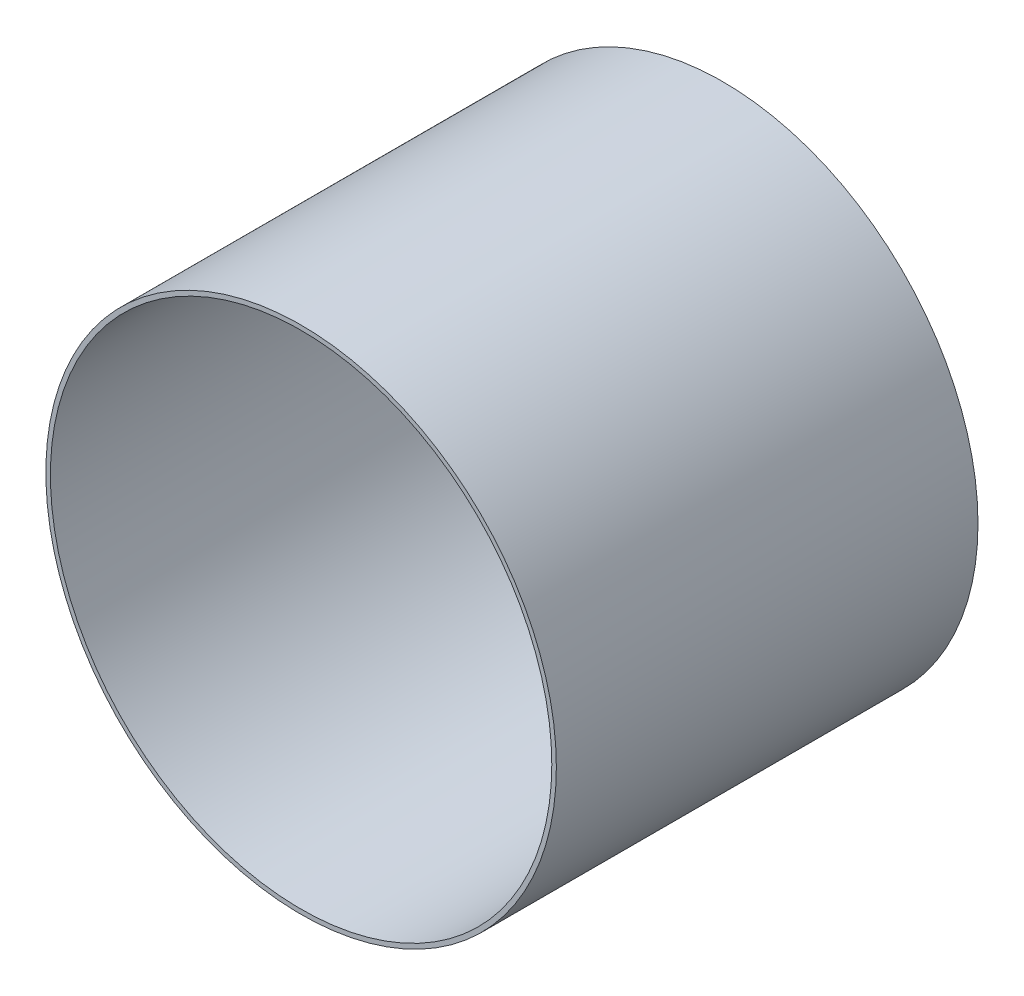
ISO-10303-21;
HEADER;
FILE_DESCRIPTION(('STEP AP214'),'2;1');
FILE_NAME('part.step','',(''),(''),'','','');
FILE_SCHEMA(('AUTOMOTIVE_DESIGN { 1 0 10303 214 1 1 1 1 }'));
ENDSEC;
DATA;
#1=APPLICATION_CONTEXT('core data for automotive mechanical design processes');
#2=APPLICATION_PROTOCOL_DEFINITION('international standard','automotive_design',2000,#1);
#3=PRODUCT_CONTEXT('',#1,'mechanical');
#4=PRODUCT('Part','Part','',(#3));
#5=PRODUCT_RELATED_PRODUCT_CATEGORY('part','',(#4));
#6=PRODUCT_DEFINITION_FORMATION('','',#4);
#7=PRODUCT_DEFINITION_CONTEXT('part definition',#1,'design');
#8=PRODUCT_DEFINITION('design','',#6,#7);
#9=PRODUCT_DEFINITION_SHAPE('','',#8);
#10=(LENGTH_UNIT() NAMED_UNIT(*) SI_UNIT(.MILLI.,.METRE.));
#11=(NAMED_UNIT(*) PLANE_ANGLE_UNIT() SI_UNIT($,.RADIAN.));
#12=(NAMED_UNIT(*) SI_UNIT($,.STERADIAN.) SOLID_ANGLE_UNIT());
#13=UNCERTAINTY_MEASURE_WITH_UNIT(LENGTH_MEASURE(1.E-05),#10,'distance_accuracy_value','');
#14=(GEOMETRIC_REPRESENTATION_CONTEXT(3) GLOBAL_UNCERTAINTY_ASSIGNED_CONTEXT((#13)) GLOBAL_UNIT_ASSIGNED_CONTEXT((#10,
#11,#12)) REPRESENTATION_CONTEXT('',''));
#15=CARTESIAN_POINT('',(0.,0.,0.));
#16=DIRECTION('',(0.,0.,1.));
#17=DIRECTION('',(1.,0.,0.));
#18=AXIS2_PLACEMENT_3D('',#15,#16,#17);
#19=CARTESIAN_POINT('',(0.,0.,117.475));
#20=DIRECTION('',(0.,0.,1.));
#21=DIRECTION('',(1.,0.,0.));
#22=AXIS2_PLACEMENT_3D('',#19,#20,#21);
#23=PLANE('',#22);
#24=CARTESIAN_POINT('',(0.,0.,117.475));
#25=DIRECTION('',(0.,0.,1.));
#26=DIRECTION('',(1.,0.,0.));
#27=AXIS2_PLACEMENT_3D('',#24,#25,#26);
#28=CIRCLE('',#27,71.12);
#29=CARTESIAN_POINT('',(71.12,0.,117.475));
#30=VERTEX_POINT('',#29);
#31=EDGE_CURVE('E10',#30,#30,#28,.T.);
#32=ORIENTED_EDGE('',*,*,#31,.T.);
#33=EDGE_LOOP('',(#32));
#34=FACE_BOUND('',#33,.T.);
#35=CARTESIAN_POINT('',(0.,0.,117.475));
#36=DIRECTION('',(0.,0.,1.));
#37=DIRECTION('',(1.,0.,0.));
#38=AXIS2_PLACEMENT_3D('',#35,#36,#37);
#39=CIRCLE('',#38,69.85);
#40=CARTESIAN_POINT('',(69.85,0.,117.475));
#41=VERTEX_POINT('',#40);
#42=EDGE_CURVE('E46',#41,#41,#39,.T.);
#43=ORIENTED_EDGE('',*,*,#42,.F.);
#44=EDGE_LOOP('',(#43));
#45=FACE_BOUND('',#44,.T.);
#46=ADVANCED_FACE('F35',(#34,#45),#23,.T.);
#47=CARTESIAN_POINT('',(0.,0.,0.));
#48=DIRECTION('',(0.,0.,1.));
#49=DIRECTION('',(1.,0.,0.));
#50=AXIS2_PLACEMENT_3D('',#47,#48,#49);
#51=PLANE('',#50);
#52=CARTESIAN_POINT('',(0.,0.,0.));
#53=DIRECTION('',(0.,0.,1.));
#54=DIRECTION('',(1.,0.,0.));
#55=AXIS2_PLACEMENT_3D('',#52,#53,#54);
#56=CIRCLE('',#55,71.12);
#57=CARTESIAN_POINT('',(71.12,0.,0.));
#58=VERTEX_POINT('',#57);
#59=EDGE_CURVE('E39',#58,#58,#56,.T.);
#60=ORIENTED_EDGE('',*,*,#59,.F.);
#61=EDGE_LOOP('',(#60));
#62=FACE_BOUND('',#61,.T.);
#63=CARTESIAN_POINT('',(0.,0.,0.));
#64=DIRECTION('',(0.,0.,1.));
#65=DIRECTION('',(1.,0.,0.));
#66=AXIS2_PLACEMENT_3D('',#63,#64,#65);
#67=CIRCLE('',#66,69.85);
#68=CARTESIAN_POINT('',(69.85,0.,0.));
#69=VERTEX_POINT('',#68);
#70=EDGE_CURVE('E48',#69,#69,#67,.T.);
#71=ORIENTED_EDGE('',*,*,#70,.T.);
#72=EDGE_LOOP('',(#71));
#73=FACE_BOUND('',#72,.T.);
#74=ADVANCED_FACE('F58',(#62,#73),#51,.F.);
#75=CARTESIAN_POINT('',(0.,0.,117.475));
#76=DIRECTION('',(0.,0.,-1.));
#77=DIRECTION('',(-1.,0.,0.));
#78=AXIS2_PLACEMENT_3D('',#75,#76,#77);
#79=CYLINDRICAL_SURFACE('',#78,71.12);
#80=ORIENTED_EDGE('',*,*,#31,.F.);
#81=EDGE_LOOP('',(#80));
#82=FACE_BOUND('',#81,.T.);
#83=ORIENTED_EDGE('',*,*,#59,.T.);
#84=EDGE_LOOP('',(#83));
#85=FACE_BOUND('',#84,.T.);
#86=ADVANCED_FACE('F37',(#82,#85),#79,.T.);
#87=CARTESIAN_POINT('',(0.,0.,117.475));
#88=DIRECTION('',(0.,0.,-1.));
#89=DIRECTION('',(-1.,0.,0.));
#90=AXIS2_PLACEMENT_3D('',#87,#88,#89);
#91=CYLINDRICAL_SURFACE('',#90,69.85);
#92=ORIENTED_EDGE('',*,*,#42,.T.);
#93=EDGE_LOOP('',(#92));
#94=FACE_BOUND('',#93,.T.);
#95=ORIENTED_EDGE('',*,*,#70,.F.);
#96=EDGE_LOOP('',(#95));
#97=FACE_BOUND('',#96,.T.);
#98=ADVANCED_FACE('F54',(#94,#97),#91,.F.);
#99=CLOSED_SHELL('',(#46,#74,#86,#98));
#100=MANIFOLD_SOLID_BREP('B2',#99);
#101=ADVANCED_BREP_SHAPE_REPRESENTATION('',(#18,#100),#14);
#102=SHAPE_DEFINITION_REPRESENTATION(#9,#101);
ENDSEC;
END-ISO-10303-21;
